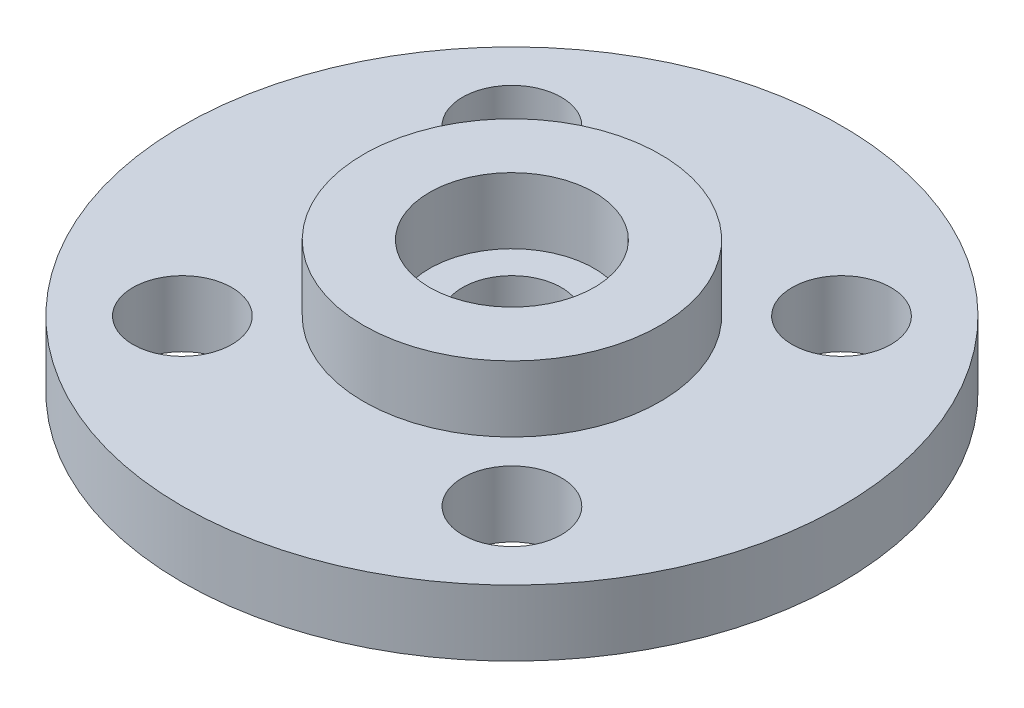
ISO-10303-21;
HEADER;
FILE_DESCRIPTION(('STEP AP214'),'2;1');
FILE_NAME('part.step','',(''),(''),'','','');
FILE_SCHEMA(('AUTOMOTIVE_DESIGN { 1 0 10303 214 1 1 1 1 }'));
ENDSEC;
DATA;
#1=APPLICATION_CONTEXT('core data for automotive mechanical design processes');
#2=APPLICATION_PROTOCOL_DEFINITION('international standard','automotive_design',2000,#1);
#3=PRODUCT_CONTEXT('',#1,'mechanical');
#4=PRODUCT('Part','Part','',(#3));
#5=PRODUCT_RELATED_PRODUCT_CATEGORY('part','',(#4));
#6=PRODUCT_DEFINITION_FORMATION('','',#4);
#7=PRODUCT_DEFINITION_CONTEXT('part definition',#1,'design');
#8=PRODUCT_DEFINITION('design','',#6,#7);
#9=PRODUCT_DEFINITION_SHAPE('','',#8);
#10=(LENGTH_UNIT() NAMED_UNIT(*) SI_UNIT(.MILLI.,.METRE.));
#11=(NAMED_UNIT(*) PLANE_ANGLE_UNIT() SI_UNIT($,.RADIAN.));
#12=(NAMED_UNIT(*) SI_UNIT($,.STERADIAN.) SOLID_ANGLE_UNIT());
#13=UNCERTAINTY_MEASURE_WITH_UNIT(LENGTH_MEASURE(1.E-05),#10,'distance_accuracy_value','');
#14=(GEOMETRIC_REPRESENTATION_CONTEXT(3) GLOBAL_UNCERTAINTY_ASSIGNED_CONTEXT((#13)) GLOBAL_UNIT_ASSIGNED_CONTEXT((#10,
#11,#12)) REPRESENTATION_CONTEXT('',''));
#15=CARTESIAN_POINT('',(0.,0.,0.));
#16=DIRECTION('',(0.,0.,1.));
#17=DIRECTION('',(1.,0.,0.));
#18=AXIS2_PLACEMENT_3D('',#15,#16,#17);
#19=CARTESIAN_POINT('',(0.,2.,0.));
#20=DIRECTION('',(0.,1.,0.));
#21=DIRECTION('',(0.,0.,1.));
#22=AXIS2_PLACEMENT_3D('',#19,#20,#21);
#23=PLANE('',#22);
#24=CARTESIAN_POINT('',(0.,2.,0.));
#25=DIRECTION('',(0.,1.,0.));
#26=DIRECTION('',(0.,0.,1.));
#27=AXIS2_PLACEMENT_3D('',#24,#25,#26);
#28=CIRCLE('',#27,1.5);
#29=CARTESIAN_POINT('',(0.,2.,1.5));
#30=VERTEX_POINT('',#29);
#31=EDGE_CURVE('E79',#30,#30,#28,.T.);
#32=ORIENTED_EDGE('',*,*,#31,.F.);
#33=EDGE_LOOP('',(#32));
#34=FACE_BOUND('',#33,.T.);
#35=CARTESIAN_POINT('',(0.,2.,0.));
#36=DIRECTION('',(0.,1.,0.));
#37=DIRECTION('',(0.,0.,1.));
#38=AXIS2_PLACEMENT_3D('',#35,#36,#37);
#39=CIRCLE('',#38,2.5);
#40=CARTESIAN_POINT('',(0.,2.,2.5));
#41=VERTEX_POINT('',#40);
#42=EDGE_CURVE('E207',#41,#41,#39,.T.);
#43=ORIENTED_EDGE('',*,*,#42,.T.);
#44=EDGE_LOOP('',(#43));
#45=FACE_BOUND('',#44,.T.);
#46=ADVANCED_FACE('F37',(#34,#45),#23,.T.);
#47=CARTESIAN_POINT('',(0.,2.,0.));
#48=DIRECTION('',(0.,1.,0.));
#49=DIRECTION('',(0.,0.,1.));
#50=AXIS2_PLACEMENT_3D('',#47,#48,#49);
#51=CIRCLE('',#50,4.5);
#52=CARTESIAN_POINT('',(0.,2.,4.5));
#53=VERTEX_POINT('',#52);
#54=EDGE_CURVE('E10',#53,#53,#51,.T.);
#55=ORIENTED_EDGE('',*,*,#54,.F.);
#56=EDGE_LOOP('',(#55));
#57=FACE_BOUND('',#56,.T.);
#58=CARTESIAN_POINT('',(5.,2.,5.));
#59=DIRECTION('',(0.,1.,0.));
#60=DIRECTION('',(0.,0.,1.));
#61=AXIS2_PLACEMENT_3D('',#58,#59,#60);
#62=CIRCLE('',#61,1.5);
#63=CARTESIAN_POINT('',(5.,2.,6.5));
#64=VERTEX_POINT('',#63);
#65=EDGE_CURVE('E61',#64,#64,#62,.T.);
#66=ORIENTED_EDGE('',*,*,#65,.F.);
#67=EDGE_LOOP('',(#66));
#68=FACE_BOUND('',#67,.T.);
#69=CARTESIAN_POINT('',(-5.,2.,-5.));
#70=DIRECTION('',(0.,1.,0.));
#71=DIRECTION('',(0.,0.,1.));
#72=AXIS2_PLACEMENT_3D('',#69,#70,#71);
#73=CIRCLE('',#72,1.5);
#74=CARTESIAN_POINT('',(-5.,2.,-3.5));
#75=VERTEX_POINT('',#74);
#76=EDGE_CURVE('E73',#75,#75,#73,.T.);
#77=ORIENTED_EDGE('',*,*,#76,.F.);
#78=EDGE_LOOP('',(#77));
#79=FACE_BOUND('',#78,.T.);
#80=CARTESIAN_POINT('',(0.,2.,0.));
#81=DIRECTION('',(0.,1.,0.));
#82=DIRECTION('',(0.,0.,1.));
#83=AXIS2_PLACEMENT_3D('',#80,#81,#82);
#84=CIRCLE('',#83,10.);
#85=CARTESIAN_POINT('',(0.,2.,10.));
#86=VERTEX_POINT('',#85);
#87=EDGE_CURVE('E45',#86,#86,#84,.T.);
#88=ORIENTED_EDGE('',*,*,#87,.T.);
#89=EDGE_LOOP('',(#88));
#90=FACE_BOUND('',#89,.T.);
#91=CARTESIAN_POINT('',(5.,2.,-5.));
#92=DIRECTION('',(0.,1.,0.));
#93=DIRECTION('',(0.,0.,1.));
#94=AXIS2_PLACEMENT_3D('',#91,#92,#93);
#95=CIRCLE('',#94,1.5);
#96=CARTESIAN_POINT('',(5.,2.,-3.5));
#97=VERTEX_POINT('',#96);
#98=EDGE_CURVE('E67',#97,#97,#95,.T.);
#99=ORIENTED_EDGE('',*,*,#98,.F.);
#100=EDGE_LOOP('',(#99));
#101=FACE_BOUND('',#100,.T.);
#102=CARTESIAN_POINT('',(-5.,2.,5.));
#103=DIRECTION('',(0.,1.,0.));
#104=DIRECTION('',(0.,0.,1.));
#105=AXIS2_PLACEMENT_3D('',#102,#103,#104);
#106=CIRCLE('',#105,1.5);
#107=CARTESIAN_POINT('',(-5.,2.,6.5));
#108=VERTEX_POINT('',#107);
#109=EDGE_CURVE('E54',#108,#108,#106,.T.);
#110=ORIENTED_EDGE('',*,*,#109,.F.);
#111=EDGE_LOOP('',(#110));
#112=FACE_BOUND('',#111,.T.);
#113=ADVANCED_FACE('F103',(#57,#68,#79,#90,#101,#112),#23,.T.);
#114=CARTESIAN_POINT('',(0.,0.,0.));
#115=DIRECTION('',(0.,1.,0.));
#116=DIRECTION('',(0.,0.,1.));
#117=AXIS2_PLACEMENT_3D('',#114,#115,#116);
#118=PLANE('',#117);
#119=CARTESIAN_POINT('',(0.,0.,0.));
#120=DIRECTION('',(0.,1.,0.));
#121=DIRECTION('',(0.,0.,1.));
#122=AXIS2_PLACEMENT_3D('',#119,#120,#121);
#123=CIRCLE('',#122,10.);
#124=CARTESIAN_POINT('',(0.,0.,10.));
#125=VERTEX_POINT('',#124);
#126=EDGE_CURVE('E41',#125,#125,#123,.T.);
#127=ORIENTED_EDGE('',*,*,#126,.F.);
#128=EDGE_LOOP('',(#127));
#129=FACE_BOUND('',#128,.T.);
#130=CARTESIAN_POINT('',(0.,0.,0.));
#131=DIRECTION('',(0.,1.,0.));
#132=DIRECTION('',(0.,0.,1.));
#133=AXIS2_PLACEMENT_3D('',#130,#131,#132);
#134=CIRCLE('',#133,1.5);
#135=CARTESIAN_POINT('',(0.,0.,1.5));
#136=VERTEX_POINT('',#135);
#137=EDGE_CURVE('E76',#136,#136,#134,.T.);
#138=ORIENTED_EDGE('',*,*,#137,.T.);
#139=EDGE_LOOP('',(#138));
#140=FACE_BOUND('',#139,.T.);
#141=CARTESIAN_POINT('',(-5.,0.,-5.));
#142=DIRECTION('',(0.,1.,0.));
#143=DIRECTION('',(0.,0.,1.));
#144=AXIS2_PLACEMENT_3D('',#141,#142,#143);
#145=CIRCLE('',#144,1.5);
#146=CARTESIAN_POINT('',(-5.,0.,-3.5));
#147=VERTEX_POINT('',#146);
#148=EDGE_CURVE('E70',#147,#147,#145,.T.);
#149=ORIENTED_EDGE('',*,*,#148,.T.);
#150=EDGE_LOOP('',(#149));
#151=FACE_BOUND('',#150,.T.);
#152=CARTESIAN_POINT('',(5.,0.,-5.));
#153=DIRECTION('',(0.,1.,0.));
#154=DIRECTION('',(0.,0.,1.));
#155=AXIS2_PLACEMENT_3D('',#152,#153,#154);
#156=CIRCLE('',#155,1.5);
#157=CARTESIAN_POINT('',(5.,0.,-3.5));
#158=VERTEX_POINT('',#157);
#159=EDGE_CURVE('E64',#158,#158,#156,.T.);
#160=ORIENTED_EDGE('',*,*,#159,.T.);
#161=EDGE_LOOP('',(#160));
#162=FACE_BOUND('',#161,.T.);
#163=CARTESIAN_POINT('',(5.,0.,5.));
#164=DIRECTION('',(0.,1.,0.));
#165=DIRECTION('',(0.,0.,1.));
#166=AXIS2_PLACEMENT_3D('',#163,#164,#165);
#167=CIRCLE('',#166,1.5);
#168=CARTESIAN_POINT('',(5.,0.,6.5));
#169=VERTEX_POINT('',#168);
#170=EDGE_CURVE('E57',#169,#169,#167,.T.);
#171=ORIENTED_EDGE('',*,*,#170,.T.);
#172=EDGE_LOOP('',(#171));
#173=FACE_BOUND('',#172,.T.);
#174=CARTESIAN_POINT('',(-5.,0.,5.));
#175=DIRECTION('',(0.,1.,0.));
#176=DIRECTION('',(0.,0.,1.));
#177=AXIS2_PLACEMENT_3D('',#174,#175,#176);
#178=CIRCLE('',#177,1.5);
#179=CARTESIAN_POINT('',(-5.,0.,6.5));
#180=VERTEX_POINT('',#179);
#181=EDGE_CURVE('E58',#180,#180,#178,.T.);
#182=ORIENTED_EDGE('',*,*,#181,.T.);
#183=EDGE_LOOP('',(#182));
#184=FACE_BOUND('',#183,.T.);
#185=ADVANCED_FACE('F85',(#129,#140,#151,#162,#173,#184),#118,.F.);
#186=CARTESIAN_POINT('',(0.,2.,0.));
#187=DIRECTION('',(0.,-1.,0.));
#188=DIRECTION('',(0.,0.,-1.));
#189=AXIS2_PLACEMENT_3D('',#186,#187,#188);
#190=CYLINDRICAL_SURFACE('',#189,10.);
#191=ORIENTED_EDGE('',*,*,#87,.F.);
#192=EDGE_LOOP('',(#191));
#193=FACE_BOUND('',#192,.T.);
#194=ORIENTED_EDGE('',*,*,#126,.T.);
#195=EDGE_LOOP('',(#194));
#196=FACE_BOUND('',#195,.T.);
#197=ADVANCED_FACE('F39',(#193,#196),#190,.T.);
#198=CARTESIAN_POINT('',(0.,2.,0.));
#199=DIRECTION('',(0.,-1.,0.));
#200=DIRECTION('',(0.,0.,-1.));
#201=AXIS2_PLACEMENT_3D('',#198,#199,#200);
#202=CYLINDRICAL_SURFACE('',#201,1.5);
#203=ORIENTED_EDGE('',*,*,#31,.T.);
#204=EDGE_LOOP('',(#203));
#205=FACE_BOUND('',#204,.T.);
#206=ORIENTED_EDGE('',*,*,#137,.F.);
#207=EDGE_LOOP('',(#206));
#208=FACE_BOUND('',#207,.T.);
#209=ADVANCED_FACE('F88',(#205,#208),#202,.F.);
#210=CARTESIAN_POINT('',(-5.,2.,-5.));
#211=DIRECTION('',(0.,-1.,0.));
#212=DIRECTION('',(0.,0.,-1.));
#213=AXIS2_PLACEMENT_3D('',#210,#211,#212);
#214=CYLINDRICAL_SURFACE('',#213,1.5);
#215=ORIENTED_EDGE('',*,*,#76,.T.);
#216=EDGE_LOOP('',(#215));
#217=FACE_BOUND('',#216,.T.);
#218=ORIENTED_EDGE('',*,*,#148,.F.);
#219=EDGE_LOOP('',(#218));
#220=FACE_BOUND('',#219,.T.);
#221=ADVANCED_FACE('F90',(#217,#220),#214,.F.);
#222=CARTESIAN_POINT('',(5.,2.,-5.));
#223=DIRECTION('',(0.,-1.,0.));
#224=DIRECTION('',(0.,0.,-1.));
#225=AXIS2_PLACEMENT_3D('',#222,#223,#224);
#226=CYLINDRICAL_SURFACE('',#225,1.5);
#227=ORIENTED_EDGE('',*,*,#98,.T.);
#228=EDGE_LOOP('',(#227));
#229=FACE_BOUND('',#228,.T.);
#230=ORIENTED_EDGE('',*,*,#159,.F.);
#231=EDGE_LOOP('',(#230));
#232=FACE_BOUND('',#231,.T.);
#233=ADVANCED_FACE('F97',(#229,#232),#226,.F.);
#234=CARTESIAN_POINT('',(5.,2.,5.));
#235=DIRECTION('',(0.,-1.,0.));
#236=DIRECTION('',(0.,0.,-1.));
#237=AXIS2_PLACEMENT_3D('',#234,#235,#236);
#238=CYLINDRICAL_SURFACE('',#237,1.5);
#239=ORIENTED_EDGE('',*,*,#65,.T.);
#240=EDGE_LOOP('',(#239));
#241=FACE_BOUND('',#240,.T.);
#242=ORIENTED_EDGE('',*,*,#170,.F.);
#243=EDGE_LOOP('',(#242));
#244=FACE_BOUND('',#243,.T.);
#245=ADVANCED_FACE('F145',(#241,#244),#238,.F.);
#246=CARTESIAN_POINT('',(-5.,2.,5.));
#247=DIRECTION('',(0.,-1.,0.));
#248=DIRECTION('',(0.,0.,-1.));
#249=AXIS2_PLACEMENT_3D('',#246,#247,#248);
#250=CYLINDRICAL_SURFACE('',#249,1.5);
#251=ORIENTED_EDGE('',*,*,#109,.T.);
#252=EDGE_LOOP('',(#251));
#253=FACE_BOUND('',#252,.T.);
#254=ORIENTED_EDGE('',*,*,#181,.F.);
#255=EDGE_LOOP('',(#254));
#256=FACE_BOUND('',#255,.T.);
#257=ADVANCED_FACE('F155',(#253,#256),#250,.F.);
#258=CARTESIAN_POINT('',(0.,4.,0.));
#259=DIRECTION('',(0.,1.,0.));
#260=DIRECTION('',(0.,0.,1.));
#261=AXIS2_PLACEMENT_3D('',#258,#259,#260);
#262=PLANE('',#261);
#263=CARTESIAN_POINT('',(0.,4.,0.));
#264=DIRECTION('',(0.,1.,0.));
#265=DIRECTION('',(0.,0.,1.));
#266=AXIS2_PLACEMENT_3D('',#263,#264,#265);
#267=CIRCLE('',#266,4.5);
#268=CARTESIAN_POINT('',(0.,4.,4.5));
#269=VERTEX_POINT('',#268);
#270=EDGE_CURVE('E52',#269,#269,#267,.T.);
#271=ORIENTED_EDGE('',*,*,#270,.T.);
#272=EDGE_LOOP('',(#271));
#273=FACE_BOUND('',#272,.T.);
#274=CARTESIAN_POINT('',(0.,4.,0.));
#275=DIRECTION('',(0.,1.,0.));
#276=DIRECTION('',(0.,0.,1.));
#277=AXIS2_PLACEMENT_3D('',#274,#275,#276);
#278=CIRCLE('',#277,2.5);
#279=CARTESIAN_POINT('',(0.,4.,2.5));
#280=VERTEX_POINT('',#279);
#281=EDGE_CURVE('E204',#280,#280,#278,.T.);
#282=ORIENTED_EDGE('',*,*,#281,.F.);
#283=EDGE_LOOP('',(#282));
#284=FACE_BOUND('',#283,.T.);
#285=ADVANCED_FACE('F164',(#273,#284),#262,.T.);
#286=CARTESIAN_POINT('',(0.,4.,0.));
#287=DIRECTION('',(0.,-1.,0.));
#288=DIRECTION('',(0.,0.,-1.));
#289=AXIS2_PLACEMENT_3D('',#286,#287,#288);
#290=CYLINDRICAL_SURFACE('',#289,4.5);
#291=ORIENTED_EDGE('',*,*,#270,.F.);
#292=EDGE_LOOP('',(#291));
#293=FACE_BOUND('',#292,.T.);
#294=ORIENTED_EDGE('',*,*,#54,.T.);
#295=EDGE_LOOP('',(#294));
#296=FACE_BOUND('',#295,.T.);
#297=ADVANCED_FACE('F178',(#293,#296),#290,.T.);
#298=CARTESIAN_POINT('',(0.,4.,0.));
#299=DIRECTION('',(0.,-1.,0.));
#300=DIRECTION('',(0.,0.,-1.));
#301=AXIS2_PLACEMENT_3D('',#298,#299,#300);
#302=CYLINDRICAL_SURFACE('',#301,2.5);
#303=ORIENTED_EDGE('',*,*,#281,.T.);
#304=EDGE_LOOP('',(#303));
#305=FACE_BOUND('',#304,.T.);
#306=ORIENTED_EDGE('',*,*,#42,.F.);
#307=EDGE_LOOP('',(#306));
#308=FACE_BOUND('',#307,.T.);
#309=ADVANCED_FACE('F188',(#305,#308),#302,.F.);
#310=CLOSED_SHELL('',(#46,#113,#185,#197,#209,#221,#233,#245,#257,#285,#297,#309));
#311=MANIFOLD_SOLID_BREP('B2',#310);
#312=ADVANCED_BREP_SHAPE_REPRESENTATION('',(#18,#311),#14);
#313=SHAPE_DEFINITION_REPRESENTATION(#9,#312);
ENDSEC;
END-ISO-10303-21;
